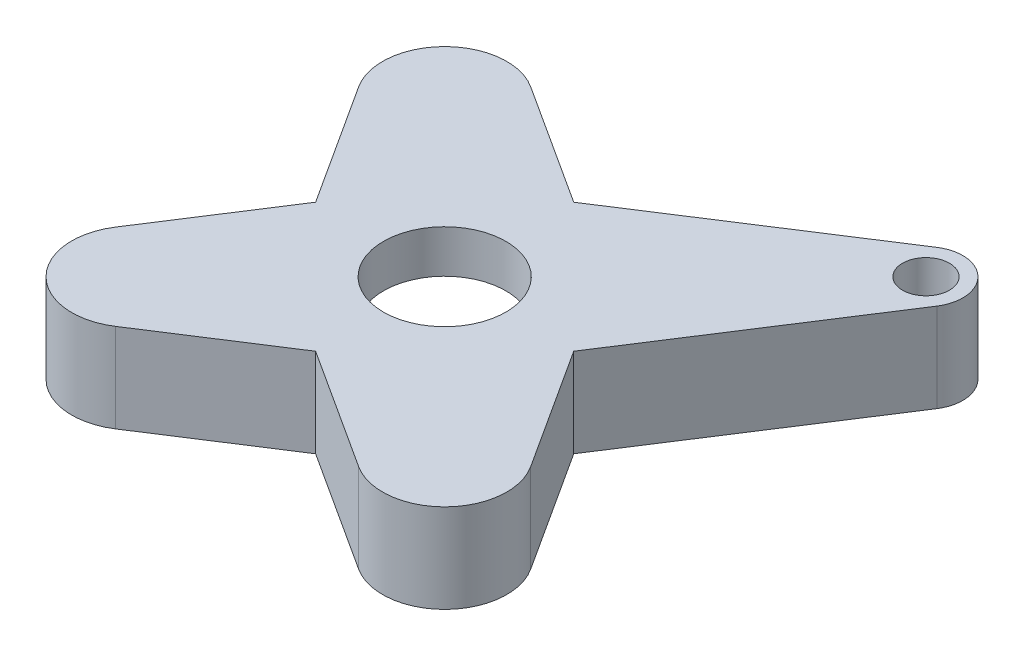
ISO-10303-21;
HEADER;
FILE_DESCRIPTION(('STEP AP214'),'2;1');
FILE_NAME('part.step','',(''),(''),'','','');
FILE_SCHEMA(('AUTOMOTIVE_DESIGN { 1 0 10303 214 1 1 1 1 }'));
ENDSEC;
DATA;
#1=APPLICATION_CONTEXT('core data for automotive mechanical design processes');
#2=APPLICATION_PROTOCOL_DEFINITION('international standard','automotive_design',2000,#1);
#3=PRODUCT_CONTEXT('',#1,'mechanical');
#4=PRODUCT('Part','Part','',(#3));
#5=PRODUCT_RELATED_PRODUCT_CATEGORY('part','',(#4));
#6=PRODUCT_DEFINITION_FORMATION('','',#4);
#7=PRODUCT_DEFINITION_CONTEXT('part definition',#1,'design');
#8=PRODUCT_DEFINITION('design','',#6,#7);
#9=PRODUCT_DEFINITION_SHAPE('','',#8);
#10=(LENGTH_UNIT() NAMED_UNIT(*) SI_UNIT(.MILLI.,.METRE.));
#11=(NAMED_UNIT(*) PLANE_ANGLE_UNIT() SI_UNIT($,.RADIAN.));
#12=(NAMED_UNIT(*) SI_UNIT($,.STERADIAN.) SOLID_ANGLE_UNIT());
#13=UNCERTAINTY_MEASURE_WITH_UNIT(LENGTH_MEASURE(1.E-05),#10,'distance_accuracy_value','');
#14=(GEOMETRIC_REPRESENTATION_CONTEXT(3) GLOBAL_UNCERTAINTY_ASSIGNED_CONTEXT((#13)) GLOBAL_UNIT_ASSIGNED_CONTEXT((#10,
#11,#12)) REPRESENTATION_CONTEXT('',''));
#15=CARTESIAN_POINT('',(0.,0.,0.));
#16=DIRECTION('',(0.,0.,1.));
#17=DIRECTION('',(1.,0.,0.));
#18=AXIS2_PLACEMENT_3D('',#15,#16,#17);
#19=CARTESIAN_POINT('',(17.9605122421383,3.2004,-17.9605122421383));
#20=DIRECTION('',(0.,-1.,0.));
#21=DIRECTION('',(0.,0.,-1.));
#22=AXIS2_PLACEMENT_3D('',#19,#20,#21);
#23=CYLINDRICAL_SURFACE('',#22,2.74563871763991);
#24=DIRECTION('',(0.,-1.,0.));
#25=VECTOR('',#24,1.);
#26=CARTESIAN_POINT('',(20.2671251717621,3.2004,-16.4711940220471));
#27=LINE('',#26,#25);
#28=CARTESIAN_POINT('',(20.2671251717621,3.2004,-16.4711940220471));
#29=VERTEX_POINT('',#28);
#30=CARTESIAN_POINT('',(20.2671251717621,-3.429,-16.4711940220471));
#31=VERTEX_POINT('',#30);
#32=EDGE_CURVE('E247',#29,#31,#27,.T.);
#33=ORIENTED_EDGE('',*,*,#32,.T.);
#34=CARTESIAN_POINT('',(17.9605122421383,-3.429,-17.9605122421383));
#35=DIRECTION('',(0.,1.,0.));
#36=DIRECTION('',(0.,0.,1.));
#37=AXIS2_PLACEMENT_3D('',#34,#35,#36);
#38=CIRCLE('',#37,2.74563871763991);
#39=CARTESIAN_POINT('',(16.4711940220471,-3.429,-20.2671251717621));
#40=VERTEX_POINT('',#39);
#41=EDGE_CURVE('E241',#40,#31,#38,.F.);
#42=ORIENTED_EDGE('',*,*,#41,.F.);
#43=DIRECTION('',(0.,-1.,0.));
#44=VECTOR('',#43,1.);
#45=CARTESIAN_POINT('',(16.4711940220471,3.2004,-20.2671251717621));
#46=LINE('',#45,#44);
#47=CARTESIAN_POINT('',(16.4711940220471,3.2004,-20.2671251717621));
#48=VERTEX_POINT('',#47);
#49=EDGE_CURVE('E11',#48,#40,#46,.T.);
#50=ORIENTED_EDGE('',*,*,#49,.F.);
#51=CARTESIAN_POINT('',(17.9605122421383,3.2004,-17.9605122421383));
#52=DIRECTION('',(0.,1.,0.));
#53=DIRECTION('',(0.,0.,1.));
#54=AXIS2_PLACEMENT_3D('',#51,#52,#53);
#55=CIRCLE('',#54,2.74563871763991);
#56=EDGE_CURVE('E403',#48,#29,#55,.F.);
#57=ORIENTED_EDGE('',*,*,#56,.T.);
#58=EDGE_LOOP('',(#33,#42,#50,#57));
#59=FACE_BOUND('',#58,.T.);
#60=ADVANCED_FACE('F41',(#59),#23,.T.);
#61=CARTESIAN_POINT('',(-4.38931909057284,3.2004,-6.79805029575222));
#62=DIRECTION('',(-0.542430513717173,0.,-0.840100671222517));
#63=DIRECTION('',(-0.840100671222517,0.,0.542430513717173));
#64=AXIS2_PLACEMENT_3D('',#61,#62,#63);
#65=PLANE('',#64);
#66=ORIENTED_EDGE('',*,*,#49,.T.);
#67=DIRECTION('',(0.840100671222517,0.,-0.542430513717173));
#68=VECTOR('',#67,1.);
#69=CARTESIAN_POINT('',(-4.38931909057284,-3.429,-6.79805029575222));
#70=LINE('',#69,#68);
#71=CARTESIAN_POINT('',(0.,-3.429,-9.6321161294378));
#72=VERTEX_POINT('',#71);
#73=EDGE_CURVE('E229',#72,#40,#70,.T.);
#74=ORIENTED_EDGE('',*,*,#73,.F.);
#75=DIRECTION('',(0.,-1.,0.));
#76=VECTOR('',#75,1.);
#77=CARTESIAN_POINT('',(0.,3.2004,-9.6321161294378));
#78=LINE('',#77,#76);
#79=CARTESIAN_POINT('',(0.,3.2004,-9.6321161294378));
#80=VERTEX_POINT('',#79);
#81=EDGE_CURVE('E49',#80,#72,#78,.T.);
#82=ORIENTED_EDGE('',*,*,#81,.F.);
#83=DIRECTION('',(0.840100671222517,0.,-0.542430513717173));
#84=VECTOR('',#83,1.);
#85=CARTESIAN_POINT('',(-4.38931909057284,3.2004,-6.79805029575222));
#86=LINE('',#85,#84);
#87=EDGE_CURVE('E231',#80,#48,#86,.T.);
#88=ORIENTED_EDGE('',*,*,#87,.T.);
#89=EDGE_LOOP('',(#66,#74,#82,#88));
#90=FACE_BOUND('',#89,.T.);
#91=ADVANCED_FACE('F228',(#90),#65,.T.);
#92=CARTESIAN_POINT('',(4.38931909057285,3.2004,-6.79805029575227));
#93=DIRECTION('',(0.542430513717171,0.,-0.840100671222518));
#94=DIRECTION('',(-0.840100671222518,0.,-0.542430513717171));
#95=AXIS2_PLACEMENT_3D('',#92,#93,#94);
#96=PLANE('',#95);
#97=ORIENTED_EDGE('',*,*,#81,.T.);
#98=DIRECTION('',(0.840100671222518,0.,0.542430513717171));
#99=VECTOR('',#98,1.);
#100=CARTESIAN_POINT('',(4.38931909057285,-3.429,-6.79805029575227));
#101=LINE('',#100,#99);
#102=CARTESIAN_POINT('',(-9.0796736278117,-3.429,-15.4946183259319));
#103=VERTEX_POINT('',#102);
#104=EDGE_CURVE('E245',#103,#72,#101,.T.);
#105=ORIENTED_EDGE('',*,*,#104,.F.);
#106=DIRECTION('',(0.,-1.,0.));
#107=VECTOR('',#106,1.);
#108=CARTESIAN_POINT('',(-9.0796736278117,3.2004,-15.4946183259319));
#109=LINE('',#108,#107);
#110=CARTESIAN_POINT('',(-9.0796736278117,3.2004,-15.4946183259319));
#111=VERTEX_POINT('',#110);
#112=EDGE_CURVE('E454',#111,#103,#109,.T.);
#113=ORIENTED_EDGE('',*,*,#112,.F.);
#114=DIRECTION('',(0.840100671222518,0.,0.542430513717171));
#115=VECTOR('',#114,1.);
#116=CARTESIAN_POINT('',(4.38931909057285,3.2004,-6.79805029575227));
#117=LINE('',#116,#115);
#118=EDGE_CURVE('E406',#111,#80,#117,.T.);
#119=ORIENTED_EDGE('',*,*,#118,.T.);
#120=EDGE_LOOP('',(#97,#105,#113,#119));
#121=FACE_BOUND('',#120,.T.);
#122=ADVANCED_FACE('F456',(#121),#96,.T.);
#123=CARTESIAN_POINT('',(-11.5965512114594,3.2004,-11.5965512114594));
#124=DIRECTION('',(0.,-1.,0.));
#125=DIRECTION('',(0.,0.,-1.));
#126=AXIS2_PLACEMENT_3D('',#123,#124,#125);
#127=CYLINDRICAL_SURFACE('',#126,4.64);
#128=ORIENTED_EDGE('',*,*,#112,.T.);
#129=CARTESIAN_POINT('',(-11.5965512114594,-3.429,-11.5965512114594));
#130=DIRECTION('',(0.,1.,0.));
#131=DIRECTION('',(0.,0.,1.));
#132=AXIS2_PLACEMENT_3D('',#129,#130,#131);
#133=CIRCLE('',#132,4.64);
#134=CARTESIAN_POINT('',(-15.4946183259319,-3.429,-9.07967362781171));
#135=VERTEX_POINT('',#134);
#136=EDGE_CURVE('E255',#135,#103,#133,.F.);
#137=ORIENTED_EDGE('',*,*,#136,.F.);
#138=DIRECTION('',(0.,-1.,0.));
#139=VECTOR('',#138,1.);
#140=CARTESIAN_POINT('',(-15.4946183259319,3.2004,-9.07967362781171));
#141=LINE('',#140,#139);
#142=CARTESIAN_POINT('',(-15.4946183259319,3.2004,-9.07967362781171));
#143=VERTEX_POINT('',#142);
#144=EDGE_CURVE('E452',#143,#135,#141,.T.);
#145=ORIENTED_EDGE('',*,*,#144,.F.);
#146=CARTESIAN_POINT('',(-11.5965512114594,3.2004,-11.5965512114594));
#147=DIRECTION('',(0.,1.,0.));
#148=DIRECTION('',(0.,0.,1.));
#149=AXIS2_PLACEMENT_3D('',#146,#147,#148);
#150=CIRCLE('',#149,4.64);
#151=EDGE_CURVE('E409',#143,#111,#150,.F.);
#152=ORIENTED_EDGE('',*,*,#151,.T.);
#153=EDGE_LOOP('',(#128,#137,#145,#152));
#154=FACE_BOUND('',#153,.T.);
#155=ADVANCED_FACE('F463',(#154),#127,.T.);
#156=CARTESIAN_POINT('',(-6.79805029575228,3.2004,4.38931909057286));
#157=DIRECTION('',(-0.840100671222519,0.,0.54243051371717));
#158=DIRECTION('',(0.54243051371717,0.,0.840100671222519));
#159=AXIS2_PLACEMENT_3D('',#156,#157,#158);
#160=PLANE('',#159);
#161=ORIENTED_EDGE('',*,*,#144,.T.);
#162=DIRECTION('',(-0.54243051371717,0.,-0.840100671222519));
#163=VECTOR('',#162,1.);
#164=CARTESIAN_POINT('',(-6.79805029575228,-3.429,4.38931909057286));
#165=LINE('',#164,#163);
#166=CARTESIAN_POINT('',(-9.6321161294378,-3.429,0.));
#167=VERTEX_POINT('',#166);
#168=EDGE_CURVE('E257',#167,#135,#165,.T.);
#169=ORIENTED_EDGE('',*,*,#168,.F.);
#170=DIRECTION('',(0.,-1.,0.));
#171=VECTOR('',#170,1.);
#172=CARTESIAN_POINT('',(-9.6321161294378,3.2004,0.));
#173=LINE('',#172,#171);
#174=CARTESIAN_POINT('',(-9.6321161294378,3.2004,0.));
#175=VERTEX_POINT('',#174);
#176=EDGE_CURVE('E450',#175,#167,#173,.T.);
#177=ORIENTED_EDGE('',*,*,#176,.F.);
#178=DIRECTION('',(-0.54243051371717,0.,-0.840100671222519));
#179=VECTOR('',#178,1.);
#180=CARTESIAN_POINT('',(-6.79805029575228,3.2004,4.38931909057286));
#181=LINE('',#180,#179);
#182=EDGE_CURVE('E412',#175,#143,#181,.T.);
#183=ORIENTED_EDGE('',*,*,#182,.T.);
#184=EDGE_LOOP('',(#161,#169,#177,#183));
#185=FACE_BOUND('',#184,.T.);
#186=ADVANCED_FACE('F467',(#185),#160,.T.);
#187=CARTESIAN_POINT('',(-6.79805029575225,3.2004,-4.38931909057285));
#188=DIRECTION('',(-0.840100671222518,0.,-0.542430513717172));
#189=DIRECTION('',(-0.542430513717172,0.,0.840100671222518));
#190=AXIS2_PLACEMENT_3D('',#187,#188,#189);
#191=PLANE('',#190);
#192=ORIENTED_EDGE('',*,*,#176,.T.);
#193=DIRECTION('',(0.542430513717172,0.,-0.840100671222518));
#194=VECTOR('',#193,1.);
#195=CARTESIAN_POINT('',(-6.79805029575225,-3.429,-4.38931909057285));
#196=LINE('',#195,#194);
#197=CARTESIAN_POINT('',(-15.4946183259319,-3.429,9.0796736278117));
#198=VERTEX_POINT('',#197);
#199=EDGE_CURVE('E260',#198,#167,#196,.T.);
#200=ORIENTED_EDGE('',*,*,#199,.F.);
#201=DIRECTION('',(0.,-1.,0.));
#202=VECTOR('',#201,1.);
#203=CARTESIAN_POINT('',(-15.4946183259319,3.2004,9.0796736278117));
#204=LINE('',#203,#202);
#205=CARTESIAN_POINT('',(-15.4946183259319,3.2004,9.0796736278117));
#206=VERTEX_POINT('',#205);
#207=EDGE_CURVE('E448',#206,#198,#204,.T.);
#208=ORIENTED_EDGE('',*,*,#207,.F.);
#209=DIRECTION('',(0.542430513717172,0.,-0.840100671222518));
#210=VECTOR('',#209,1.);
#211=CARTESIAN_POINT('',(-6.79805029575225,3.2004,-4.38931909057285));
#212=LINE('',#211,#210);
#213=EDGE_CURVE('E415',#206,#175,#212,.T.);
#214=ORIENTED_EDGE('',*,*,#213,.T.);
#215=EDGE_LOOP('',(#192,#200,#208,#214));
#216=FACE_BOUND('',#215,.T.);
#217=ADVANCED_FACE('F472',(#216),#191,.T.);
#218=CARTESIAN_POINT('',(-11.5965512114594,3.2004,11.5965512114594));
#219=DIRECTION('',(0.,-1.,0.));
#220=DIRECTION('',(0.,0.,-1.));
#221=AXIS2_PLACEMENT_3D('',#218,#219,#220);
#222=CYLINDRICAL_SURFACE('',#221,4.64);
#223=ORIENTED_EDGE('',*,*,#207,.T.);
#224=CARTESIAN_POINT('',(-11.5965512114594,-3.429,11.5965512114594));
#225=DIRECTION('',(0.,1.,0.));
#226=DIRECTION('',(0.,0.,1.));
#227=AXIS2_PLACEMENT_3D('',#224,#225,#226);
#228=CIRCLE('',#227,4.64);
#229=CARTESIAN_POINT('',(-9.07967362781171,-3.429,15.4946183259319));
#230=VERTEX_POINT('',#229);
#231=EDGE_CURVE('E263',#198,#230,#228,.T.);
#232=ORIENTED_EDGE('',*,*,#231,.T.);
#233=DIRECTION('',(0.,-1.,0.));
#234=VECTOR('',#233,1.);
#235=CARTESIAN_POINT('',(-9.07967362781171,3.2004,15.4946183259319));
#236=LINE('',#235,#234);
#237=CARTESIAN_POINT('',(-9.07967362781171,3.2004,15.4946183259319));
#238=VERTEX_POINT('',#237);
#239=EDGE_CURVE('E446',#238,#230,#236,.T.);
#240=ORIENTED_EDGE('',*,*,#239,.F.);
#241=CARTESIAN_POINT('',(-11.5965512114594,3.2004,11.5965512114594));
#242=DIRECTION('',(0.,1.,0.));
#243=DIRECTION('',(0.,0.,1.));
#244=AXIS2_PLACEMENT_3D('',#241,#242,#243);
#245=CIRCLE('',#244,4.64);
#246=EDGE_CURVE('E418',#206,#238,#245,.T.);
#247=ORIENTED_EDGE('',*,*,#246,.F.);
#248=EDGE_LOOP('',(#223,#232,#240,#247));
#249=FACE_BOUND('',#248,.T.);
#250=ADVANCED_FACE('F479',(#249),#222,.T.);
#251=CARTESIAN_POINT('',(4.38931909057286,3.2004,6.79805029575229));
#252=DIRECTION('',(-0.54243051371717,0.,-0.840100671222519));
#253=DIRECTION('',(-0.840100671222519,0.,0.54243051371717));
#254=AXIS2_PLACEMENT_3D('',#251,#252,#253);
#255=PLANE('',#254);
#256=ORIENTED_EDGE('',*,*,#239,.T.);
#257=DIRECTION('',(0.840100671222519,0.,-0.54243051371717));
#258=VECTOR('',#257,1.);
#259=CARTESIAN_POINT('',(4.38931909057286,-3.429,6.79805029575229));
#260=LINE('',#259,#258);
#261=CARTESIAN_POINT('',(0.,-3.429,9.6321161294378));
#262=VERTEX_POINT('',#261);
#263=EDGE_CURVE('E266',#230,#262,#260,.T.);
#264=ORIENTED_EDGE('',*,*,#263,.T.);
#265=DIRECTION('',(0.,-1.,0.));
#266=VECTOR('',#265,1.);
#267=CARTESIAN_POINT('',(0.,3.2004,9.6321161294378));
#268=LINE('',#267,#266);
#269=CARTESIAN_POINT('',(0.,3.2004,9.6321161294378));
#270=VERTEX_POINT('',#269);
#271=EDGE_CURVE('E444',#270,#262,#268,.T.);
#272=ORIENTED_EDGE('',*,*,#271,.F.);
#273=DIRECTION('',(0.840100671222519,0.,-0.54243051371717));
#274=VECTOR('',#273,1.);
#275=CARTESIAN_POINT('',(4.38931909057286,3.2004,6.79805029575229));
#276=LINE('',#275,#274);
#277=EDGE_CURVE('E421',#238,#270,#276,.T.);
#278=ORIENTED_EDGE('',*,*,#277,.F.);
#279=EDGE_LOOP('',(#256,#264,#272,#278));
#280=FACE_BOUND('',#279,.T.);
#281=ADVANCED_FACE('F481',(#280),#255,.F.);
#282=CARTESIAN_POINT('',(-4.38931909057285,3.2004,6.79805029575226));
#283=DIRECTION('',(-0.542430513717171,0.,0.840100671222518));
#284=DIRECTION('',(0.840100671222518,0.,0.542430513717171));
#285=AXIS2_PLACEMENT_3D('',#282,#283,#284);
#286=PLANE('',#285);
#287=ORIENTED_EDGE('',*,*,#271,.T.);
#288=DIRECTION('',(-0.840100671222518,0.,-0.542430513717171));
#289=VECTOR('',#288,1.);
#290=CARTESIAN_POINT('',(-4.38931909057285,-3.429,6.79805029575226));
#291=LINE('',#290,#289);
#292=CARTESIAN_POINT('',(9.07967362781171,-3.429,15.4946183259319));
#293=VERTEX_POINT('',#292);
#294=EDGE_CURVE('E269',#293,#262,#291,.T.);
#295=ORIENTED_EDGE('',*,*,#294,.F.);
#296=DIRECTION('',(0.,-1.,0.));
#297=VECTOR('',#296,1.);
#298=CARTESIAN_POINT('',(9.07967362781171,3.2004,15.4946183259319));
#299=LINE('',#298,#297);
#300=CARTESIAN_POINT('',(9.07967362781171,3.2004,15.4946183259319));
#301=VERTEX_POINT('',#300);
#302=EDGE_CURVE('E442',#301,#293,#299,.T.);
#303=ORIENTED_EDGE('',*,*,#302,.F.);
#304=DIRECTION('',(-0.840100671222518,0.,-0.542430513717171));
#305=VECTOR('',#304,1.);
#306=CARTESIAN_POINT('',(-4.38931909057285,3.2004,6.79805029575226));
#307=LINE('',#306,#305);
#308=EDGE_CURVE('E423',#301,#270,#307,.T.);
#309=ORIENTED_EDGE('',*,*,#308,.T.);
#310=EDGE_LOOP('',(#287,#295,#303,#309));
#311=FACE_BOUND('',#310,.T.);
#312=ADVANCED_FACE('F486',(#311),#286,.T.);
#313=CARTESIAN_POINT('',(11.5965512114594,3.2004,11.5965512114594));
#314=DIRECTION('',(0.,-1.,0.));
#315=DIRECTION('',(0.,0.,-1.));
#316=AXIS2_PLACEMENT_3D('',#313,#314,#315);
#317=CYLINDRICAL_SURFACE('',#316,4.63999999999999);
#318=ORIENTED_EDGE('',*,*,#302,.T.);
#319=CARTESIAN_POINT('',(11.5965512114594,-3.429,11.5965512114594));
#320=DIRECTION('',(0.,1.,0.));
#321=DIRECTION('',(0.,0.,1.));
#322=AXIS2_PLACEMENT_3D('',#319,#320,#321);
#323=CIRCLE('',#322,4.63999999999999);
#324=CARTESIAN_POINT('',(15.4946183259319,-3.429,9.07967362781171));
#325=VERTEX_POINT('',#324);
#326=EDGE_CURVE('E272',#325,#293,#323,.F.);
#327=ORIENTED_EDGE('',*,*,#326,.F.);
#328=DIRECTION('',(0.,-1.,0.));
#329=VECTOR('',#328,1.);
#330=CARTESIAN_POINT('',(15.4946183259319,3.2004,9.07967362781171));
#331=LINE('',#330,#329);
#332=CARTESIAN_POINT('',(15.4946183259319,3.2004,9.07967362781171));
#333=VERTEX_POINT('',#332);
#334=EDGE_CURVE('E440',#333,#325,#331,.T.);
#335=ORIENTED_EDGE('',*,*,#334,.F.);
#336=CARTESIAN_POINT('',(11.5965512114594,3.2004,11.5965512114594));
#337=DIRECTION('',(0.,1.,0.));
#338=DIRECTION('',(0.,0.,1.));
#339=AXIS2_PLACEMENT_3D('',#336,#337,#338);
#340=CIRCLE('',#339,4.63999999999999);
#341=EDGE_CURVE('E426',#333,#301,#340,.F.);
#342=ORIENTED_EDGE('',*,*,#341,.T.);
#343=EDGE_LOOP('',(#318,#327,#335,#342));
#344=FACE_BOUND('',#343,.T.);
#345=ADVANCED_FACE('F489',(#344),#317,.T.);
#346=CARTESIAN_POINT('',(6.79805029575228,3.2004,-4.38931909057285));
#347=DIRECTION('',(-0.840100671222519,0.,0.54243051371717));
#348=DIRECTION('',(0.54243051371717,0.,0.840100671222519));
#349=AXIS2_PLACEMENT_3D('',#346,#347,#348);
#350=PLANE('',#349);
#351=ORIENTED_EDGE('',*,*,#334,.T.);
#352=DIRECTION('',(-0.54243051371717,0.,-0.840100671222519));
#353=VECTOR('',#352,1.);
#354=CARTESIAN_POINT('',(6.79805029575228,-3.429,-4.38931909057285));
#355=LINE('',#354,#353);
#356=CARTESIAN_POINT('',(9.6321161294378,-3.429,0.));
#357=VERTEX_POINT('',#356);
#358=EDGE_CURVE('E275',#325,#357,#355,.T.);
#359=ORIENTED_EDGE('',*,*,#358,.T.);
#360=DIRECTION('',(0.,-1.,0.));
#361=VECTOR('',#360,1.);
#362=CARTESIAN_POINT('',(9.6321161294378,3.2004,0.));
#363=LINE('',#362,#361);
#364=CARTESIAN_POINT('',(9.6321161294378,3.2004,0.));
#365=VERTEX_POINT('',#364);
#366=EDGE_CURVE('E438',#365,#357,#363,.T.);
#367=ORIENTED_EDGE('',*,*,#366,.F.);
#368=DIRECTION('',(-0.54243051371717,0.,-0.840100671222519));
#369=VECTOR('',#368,1.);
#370=CARTESIAN_POINT('',(6.79805029575228,3.2004,-4.38931909057285));
#371=LINE('',#370,#369);
#372=EDGE_CURVE('E429',#333,#365,#371,.T.);
#373=ORIENTED_EDGE('',*,*,#372,.F.);
#374=EDGE_LOOP('',(#351,#359,#367,#373));
#375=FACE_BOUND('',#374,.T.);
#376=ADVANCED_FACE('F493',(#375),#350,.F.);
#377=CARTESIAN_POINT('',(6.79805029575227,3.2004,4.38931909057286));
#378=DIRECTION('',(-0.840100671222518,0.,-0.542430513717171));
#379=DIRECTION('',(-0.542430513717171,0.,0.840100671222519));
#380=AXIS2_PLACEMENT_3D('',#377,#378,#379);
#381=PLANE('',#380);
#382=ORIENTED_EDGE('',*,*,#366,.T.);
#383=DIRECTION('',(0.542430513717171,0.,-0.840100671222518));
#384=VECTOR('',#383,1.);
#385=CARTESIAN_POINT('',(6.79805029575227,-3.429,4.38931909057286));
#386=LINE('',#385,#384);
#387=EDGE_CURVE('E278',#357,#31,#386,.T.);
#388=ORIENTED_EDGE('',*,*,#387,.T.);
#389=ORIENTED_EDGE('',*,*,#32,.F.);
#390=DIRECTION('',(0.542430513717171,0.,-0.840100671222518));
#391=VECTOR('',#390,1.);
#392=CARTESIAN_POINT('',(6.79805029575227,3.2004,4.38931909057286));
#393=LINE('',#392,#391);
#394=EDGE_CURVE('E64',#365,#29,#393,.T.);
#395=ORIENTED_EDGE('',*,*,#394,.F.);
#396=EDGE_LOOP('',(#382,#388,#389,#395));
#397=FACE_BOUND('',#396,.T.);
#398=ADVANCED_FACE('F495',(#397),#381,.F.);
#399=CARTESIAN_POINT('',(17.9605122421383,3.2004,-17.9605122421383));
#400=DIRECTION('',(0.,-1.,0.));
#401=DIRECTION('',(0.,0.,-1.));
#402=AXIS2_PLACEMENT_3D('',#399,#400,#401);
#403=CYLINDRICAL_SURFACE('',#402,1.75);
#404=CARTESIAN_POINT('',(17.9605122421383,3.2004,-17.9605122421383));
#405=DIRECTION('',(0.,1.,0.));
#406=DIRECTION('',(0.,0.,1.));
#407=AXIS2_PLACEMENT_3D('',#404,#405,#406);
#408=CIRCLE('',#407,1.75);
#409=CARTESIAN_POINT('',(17.9605122421383,3.2004,-16.2105122421383));
#410=VERTEX_POINT('',#409);
#411=EDGE_CURVE('E400',#410,#410,#408,.T.);
#412=ORIENTED_EDGE('',*,*,#411,.T.);
#413=EDGE_LOOP('',(#412));
#414=FACE_BOUND('',#413,.T.);
#415=CARTESIAN_POINT('',(17.9605122421383,-3.429,-17.9605122421383));
#416=DIRECTION('',(0.,1.,0.));
#417=DIRECTION('',(0.,0.,1.));
#418=AXIS2_PLACEMENT_3D('',#415,#416,#417);
#419=CIRCLE('',#418,1.75);
#420=CARTESIAN_POINT('',(17.9605122421383,-3.429,-16.2105122421383));
#421=VERTEX_POINT('',#420);
#422=EDGE_CURVE('E248',#421,#421,#419,.T.);
#423=ORIENTED_EDGE('',*,*,#422,.F.);
#424=EDGE_LOOP('',(#423));
#425=FACE_BOUND('',#424,.T.);
#426=ADVANCED_FACE('F43',(#414,#425),#403,.F.);
#427=CARTESIAN_POINT('',(0.,3.2004,0.));
#428=DIRECTION('',(0.,-1.,0.));
#429=DIRECTION('',(0.,0.,-1.));
#430=AXIS2_PLACEMENT_3D('',#427,#428,#429);
#431=CYLINDRICAL_SURFACE('',#430,4.572);
#432=CARTESIAN_POINT('',(0.,3.2004,0.));
#433=DIRECTION('',(0.,1.,0.));
#434=DIRECTION('',(0.,0.,1.));
#435=AXIS2_PLACEMENT_3D('',#432,#433,#434);
#436=CIRCLE('',#435,4.572);
#437=CARTESIAN_POINT('',(0.,3.2004,4.572));
#438=VERTEX_POINT('',#437);
#439=EDGE_CURVE('E432',#438,#438,#436,.T.);
#440=ORIENTED_EDGE('',*,*,#439,.T.);
#441=EDGE_LOOP('',(#440));
#442=FACE_BOUND('',#441,.T.);
#443=CARTESIAN_POINT('',(0.,0.,0.));
#444=DIRECTION('',(0.,1.,0.));
#445=DIRECTION('',(0.,0.,1.));
#446=AXIS2_PLACEMENT_3D('',#443,#444,#445);
#447=CIRCLE('',#446,4.572);
#448=CARTESIAN_POINT('',(0.,0.,4.572));
#449=VERTEX_POINT('',#448);
#450=EDGE_CURVE('E368',#449,#449,#447,.T.);
#451=ORIENTED_EDGE('',*,*,#450,.F.);
#452=EDGE_LOOP('',(#451));
#453=FACE_BOUND('',#452,.T.);
#454=ADVANCED_FACE('F502',(#442,#453),#431,.F.);
#455=CARTESIAN_POINT('',(0.,3.2004,0.));
#456=DIRECTION('',(0.,1.,0.));
#457=DIRECTION('',(0.,0.,1.));
#458=AXIS2_PLACEMENT_3D('',#455,#456,#457);
#459=PLANE('',#458);
#460=ORIENTED_EDGE('',*,*,#411,.F.);
#461=EDGE_LOOP('',(#460));
#462=FACE_BOUND('',#461,.T.);
#463=ORIENTED_EDGE('',*,*,#56,.F.);
#464=ORIENTED_EDGE('',*,*,#87,.F.);
#465=ORIENTED_EDGE('',*,*,#118,.F.);
#466=ORIENTED_EDGE('',*,*,#151,.F.);
#467=ORIENTED_EDGE('',*,*,#182,.F.);
#468=ORIENTED_EDGE('',*,*,#213,.F.);
#469=ORIENTED_EDGE('',*,*,#246,.T.);
#470=ORIENTED_EDGE('',*,*,#277,.T.);
#471=ORIENTED_EDGE('',*,*,#308,.F.);
#472=ORIENTED_EDGE('',*,*,#341,.F.);
#473=ORIENTED_EDGE('',*,*,#372,.T.);
#474=ORIENTED_EDGE('',*,*,#394,.T.);
#475=EDGE_LOOP('',(#463,#464,#465,#466,#467,#468,#469,#470,#471,#472,#473,#474));
#476=FACE_BOUND('',#475,.T.);
#477=ORIENTED_EDGE('',*,*,#439,.F.);
#478=EDGE_LOOP('',(#477));
#479=FACE_BOUND('',#478,.T.);
#480=ADVANCED_FACE('F458',(#462,#476,#479),#459,.T.);
#481=CARTESIAN_POINT('',(0.,0.,0.));
#482=DIRECTION('',(0.,1.,0.));
#483=DIRECTION('',(0.,0.,1.));
#484=AXIS2_PLACEMENT_3D('',#481,#482,#483);
#485=PLANE('',#484);
#486=DIRECTION('',(0.54243051371717,0.,-0.840100671222519));
#487=VECTOR('',#486,1.);
#488=CARTESIAN_POINT('',(5.19765851707338,0.,3.35598896194164));
#489=LINE('',#488,#487);
#490=CARTESIAN_POINT('',(8.02381642200241,0.,-1.02108255758146));
#491=VERTEX_POINT('',#490);
#492=CARTESIAN_POINT('',(13.894226547253,0.,-10.1130037564429));
#493=VERTEX_POINT('',#492);
#494=EDGE_CURVE('E56',#491,#493,#489,.T.);
#495=ORIENTED_EDGE('',*,*,#494,.F.);
#496=CARTESIAN_POINT('',(8.56364547883699,0.,0.));
#497=DIRECTION('',(0.,1.,0.));
#498=DIRECTION('',(0.,0.,1.));
#499=AXIS2_PLACEMENT_3D('',#496,#497,#498);
#500=CIRCLE('',#499,1.15499999999999);
#501=CARTESIAN_POINT('',(8.02381642200239,0.,1.02108255758144));
#502=VERTEX_POINT('',#501);
#503=EDGE_CURVE('E324',#491,#502,#500,.T.);
#504=ORIENTED_EDGE('',*,*,#503,.T.);
#505=DIRECTION('',(-0.542430513717171,0.,-0.840100671222518));
#506=VECTOR('',#505,1.);
#507=CARTESIAN_POINT('',(5.19765851707337,0.,-3.35598896194164));
#508=LINE('',#507,#506);
#509=CARTESIAN_POINT('',(13.894226547253,0.,10.1130037564429));
#510=VERTEX_POINT('',#509);
#511=EDGE_CURVE('E327',#510,#502,#508,.T.);
#512=ORIENTED_EDGE('',*,*,#511,.F.);
#513=CARTESIAN_POINT('',(11.5965512114594,0.,11.5965512114594));
#514=DIRECTION('',(0.,1.,0.));
#515=DIRECTION('',(0.,0.,1.));
#516=AXIS2_PLACEMENT_3D('',#513,#514,#515);
#517=CIRCLE('',#516,2.735);
#518=CARTESIAN_POINT('',(10.1130037564429,0.,13.894226547253));
#519=VERTEX_POINT('',#518);
#520=EDGE_CURVE('E330',#510,#519,#517,.F.);
#521=ORIENTED_EDGE('',*,*,#520,.T.);
#522=DIRECTION('',(-0.840100671222518,0.,-0.542430513717171));
#523=VECTOR('',#522,1.);
#524=CARTESIAN_POINT('',(-3.35598896194164,0.,5.19765851707336));
#525=LINE('',#524,#523);
#526=CARTESIAN_POINT('',(1.02108255758145,0.,8.02381642200239));
#527=VERTEX_POINT('',#526);
#528=EDGE_CURVE('E333',#519,#527,#525,.T.);
#529=ORIENTED_EDGE('',*,*,#528,.T.);
#530=CARTESIAN_POINT('',(0.,0.,8.56364547883699));
#531=DIRECTION('',(0.,1.,0.));
#532=DIRECTION('',(0.,0.,1.));
#533=AXIS2_PLACEMENT_3D('',#530,#531,#532);
#534=CIRCLE('',#533,1.155);
#535=CARTESIAN_POINT('',(-1.02108255758145,0.,8.0238164220024));
#536=VERTEX_POINT('',#535);
#537=EDGE_CURVE('E336',#536,#527,#534,.F.);
#538=ORIENTED_EDGE('',*,*,#537,.F.);
#539=DIRECTION('',(0.840100671222518,0.,-0.542430513717172));
#540=VECTOR('',#539,1.);
#541=CARTESIAN_POINT('',(3.35598896194164,0.,5.19765851707336));
#542=LINE('',#541,#540);
#543=CARTESIAN_POINT('',(-10.1130037564429,0.,13.894226547253));
#544=VERTEX_POINT('',#543);
#545=EDGE_CURVE('E339',#544,#536,#542,.T.);
#546=ORIENTED_EDGE('',*,*,#545,.F.);
#547=CARTESIAN_POINT('',(-11.5965512114594,0.,11.5965512114594));
#548=DIRECTION('',(0.,1.,0.));
#549=DIRECTION('',(0.,0.,1.));
#550=AXIS2_PLACEMENT_3D('',#547,#548,#549);
#551=CIRCLE('',#550,2.735);
#552=CARTESIAN_POINT('',(-13.894226547253,0.,10.1130037564429));
#553=VERTEX_POINT('',#552);
#554=EDGE_CURVE('E341',#553,#544,#551,.T.);
#555=ORIENTED_EDGE('',*,*,#554,.F.);
#556=DIRECTION('',(0.542430513717172,0.,-0.840100671222518));
#557=VECTOR('',#556,1.);
#558=CARTESIAN_POINT('',(-5.19765851707336,0.,-3.35598896194164));
#559=LINE('',#558,#557);
#560=CARTESIAN_POINT('',(-8.02381642200239,0.,1.02108255758145));
#561=VERTEX_POINT('',#560);
#562=EDGE_CURVE('E343',#553,#561,#559,.T.);
#563=ORIENTED_EDGE('',*,*,#562,.T.);
#564=CARTESIAN_POINT('',(-8.56364547883699,0.,0.));
#565=DIRECTION('',(0.,1.,0.));
#566=DIRECTION('',(0.,0.,1.));
#567=AXIS2_PLACEMENT_3D('',#564,#565,#566);
#568=CIRCLE('',#567,1.155);
#569=CARTESIAN_POINT('',(-8.0238164220024,0.,-1.02108255758145));
#570=VERTEX_POINT('',#569);
#571=EDGE_CURVE('E346',#570,#561,#568,.F.);
#572=ORIENTED_EDGE('',*,*,#571,.F.);
#573=DIRECTION('',(-0.542430513717172,0.,-0.840100671222518));
#574=VECTOR('',#573,1.);
#575=CARTESIAN_POINT('',(-5.19765851707335,0.,3.35598896194164));
#576=LINE('',#575,#574);
#577=CARTESIAN_POINT('',(-13.894226547253,0.,-10.1130037564429));
#578=VERTEX_POINT('',#577);
#579=EDGE_CURVE('E349',#570,#578,#576,.T.);
#580=ORIENTED_EDGE('',*,*,#579,.T.);
#581=CARTESIAN_POINT('',(-11.5965512114594,0.,-11.5965512114594));
#582=DIRECTION('',(0.,1.,0.));
#583=DIRECTION('',(0.,0.,1.));
#584=AXIS2_PLACEMENT_3D('',#581,#582,#583);
#585=CIRCLE('',#584,2.735);
#586=CARTESIAN_POINT('',(-10.1130037564429,0.,-13.894226547253));
#587=VERTEX_POINT('',#586);
#588=EDGE_CURVE('E352',#578,#587,#585,.F.);
#589=ORIENTED_EDGE('',*,*,#588,.T.);
#590=DIRECTION('',(0.840100671222518,0.,0.542430513717171));
#591=VECTOR('',#590,1.);
#592=CARTESIAN_POINT('',(3.35598896194164,0.,-5.19765851707337));
#593=LINE('',#592,#591);
#594=CARTESIAN_POINT('',(-1.02108255758144,0.,-8.0238164220024));
#595=VERTEX_POINT('',#594);
#596=EDGE_CURVE('E355',#587,#595,#593,.T.);
#597=ORIENTED_EDGE('',*,*,#596,.T.);
#598=CARTESIAN_POINT('',(0.,0.,-8.563645478837));
#599=DIRECTION('',(0.,1.,0.));
#600=DIRECTION('',(0.,0.,1.));
#601=AXIS2_PLACEMENT_3D('',#598,#599,#600);
#602=CIRCLE('',#601,1.155);
#603=CARTESIAN_POINT('',(1.02108255758145,0.,-8.02381642200241));
#604=VERTEX_POINT('',#603);
#605=EDGE_CURVE('E358',#595,#604,#602,.T.);
#606=ORIENTED_EDGE('',*,*,#605,.T.);
#607=DIRECTION('',(0.840100671222519,0.,-0.542430513717171));
#608=VECTOR('',#607,1.);
#609=CARTESIAN_POINT('',(-3.35598896194164,0.,-5.19765851707337));
#610=LINE('',#609,#608);
#611=CARTESIAN_POINT('',(10.1130037564429,0.,-13.894226547253));
#612=VERTEX_POINT('',#611);
#613=EDGE_CURVE('E361',#604,#612,#610,.T.);
#614=ORIENTED_EDGE('',*,*,#613,.T.);
#615=CARTESIAN_POINT('',(11.5965512114594,0.,-11.5965512114594));
#616=DIRECTION('',(0.,1.,0.));
#617=DIRECTION('',(0.,0.,1.));
#618=AXIS2_PLACEMENT_3D('',#615,#616,#617);
#619=CIRCLE('',#618,2.73499999999999);
#620=EDGE_CURVE('E251',#612,#493,#619,.F.);
#621=ORIENTED_EDGE('',*,*,#620,.T.);
#622=EDGE_LOOP('',(#495,#504,#512,#521,#529,#538,#546,#555,#563,#572,#580,#589,#597,#606,#614,#621));
#623=FACE_BOUND('',#622,.T.);
#624=ORIENTED_EDGE('',*,*,#450,.T.);
#625=EDGE_LOOP('',(#624));
#626=FACE_BOUND('',#625,.T.);
#627=ADVANCED_FACE('F570',(#623,#626),#485,.F.);
#628=CARTESIAN_POINT('',(5.19765851707338,-3.429,3.35598896194164));
#629=DIRECTION('',(0.840100671222519,0.,0.54243051371717));
#630=DIRECTION('',(0.54243051371717,0.,-0.840100671222519));
#631=AXIS2_PLACEMENT_3D('',#628,#629,#630);
#632=PLANE('',#631);
#633=ORIENTED_EDGE('',*,*,#494,.T.);
#634=DIRECTION('',(0.,1.,0.));
#635=VECTOR('',#634,1.);
#636=CARTESIAN_POINT('',(13.894226547253,-3.429,-10.1130037564429));
#637=LINE('',#636,#635);
#638=CARTESIAN_POINT('',(13.894226547253,-3.429,-10.1130037564429));
#639=VERTEX_POINT('',#638);
#640=EDGE_CURVE('E366',#639,#493,#637,.T.);
#641=ORIENTED_EDGE('',*,*,#640,.F.);
#642=DIRECTION('',(0.54243051371717,0.,-0.840100671222519));
#643=VECTOR('',#642,1.);
#644=CARTESIAN_POINT('',(5.19765851707338,-3.429,3.35598896194164));
#645=LINE('',#644,#643);
#646=CARTESIAN_POINT('',(8.02381642200241,-3.429,-1.02108255758146));
#647=VERTEX_POINT('',#646);
#648=EDGE_CURVE('E280',#647,#639,#645,.T.);
#649=ORIENTED_EDGE('',*,*,#648,.F.);
#650=DIRECTION('',(0.,1.,0.));
#651=VECTOR('',#650,1.);
#652=CARTESIAN_POINT('',(8.02381642200241,-3.429,-1.02108255758146));
#653=LINE('',#652,#651);
#654=EDGE_CURVE('E322',#647,#491,#653,.T.);
#655=ORIENTED_EDGE('',*,*,#654,.T.);
#656=EDGE_LOOP('',(#633,#641,#649,#655));
#657=FACE_BOUND('',#656,.T.);
#658=ADVANCED_FACE('F563',(#657),#632,.F.);
#659=CARTESIAN_POINT('',(11.5965512114594,-3.429,-11.5965512114594));
#660=DIRECTION('',(0.,1.,0.));
#661=DIRECTION('',(0.,0.,1.));
#662=AXIS2_PLACEMENT_3D('',#659,#660,#661);
#663=CYLINDRICAL_SURFACE('',#662,2.73499999999999);
#664=ORIENTED_EDGE('',*,*,#620,.F.);
#665=DIRECTION('',(0.,1.,0.));
#666=VECTOR('',#665,1.);
#667=CARTESIAN_POINT('',(10.1130037564429,-3.429,-13.894226547253));
#668=LINE('',#667,#666);
#669=CARTESIAN_POINT('',(10.1130037564429,-3.429,-13.894226547253));
#670=VERTEX_POINT('',#669);
#671=EDGE_CURVE('E369',#670,#612,#668,.T.);
#672=ORIENTED_EDGE('',*,*,#671,.F.);
#673=CARTESIAN_POINT('',(11.5965512114594,-3.429,-11.5965512114594));
#674=DIRECTION('',(0.,1.,0.));
#675=DIRECTION('',(0.,0.,1.));
#676=AXIS2_PLACEMENT_3D('',#673,#674,#675);
#677=CIRCLE('',#676,2.73499999999999);
#678=EDGE_CURVE('E319',#670,#639,#677,.F.);
#679=ORIENTED_EDGE('',*,*,#678,.T.);
#680=ORIENTED_EDGE('',*,*,#640,.T.);
#681=EDGE_LOOP('',(#664,#672,#679,#680));
#682=FACE_BOUND('',#681,.T.);
#683=ADVANCED_FACE('F569',(#682),#663,.F.);
#684=CARTESIAN_POINT('',(-3.35598896194164,-3.429,-5.19765851707337));
#685=DIRECTION('',(0.542430513717171,0.,0.840100671222519));
#686=DIRECTION('',(0.840100671222519,0.,-0.542430513717171));
#687=AXIS2_PLACEMENT_3D('',#684,#685,#686);
#688=PLANE('',#687);
#689=ORIENTED_EDGE('',*,*,#613,.F.);
#690=DIRECTION('',(0.,1.,0.));
#691=VECTOR('',#690,1.);
#692=CARTESIAN_POINT('',(1.02108255758145,-3.429,-8.02381642200241));
#693=LINE('',#692,#691);
#694=CARTESIAN_POINT('',(1.02108255758145,-3.429,-8.02381642200241));
#695=VERTEX_POINT('',#694);
#696=EDGE_CURVE('E371',#695,#604,#693,.T.);
#697=ORIENTED_EDGE('',*,*,#696,.F.);
#698=DIRECTION('',(0.840100671222519,0.,-0.542430513717171));
#699=VECTOR('',#698,1.);
#700=CARTESIAN_POINT('',(-3.35598896194164,-3.429,-5.19765851707337));
#701=LINE('',#700,#699);
#702=EDGE_CURVE('E316',#695,#670,#701,.T.);
#703=ORIENTED_EDGE('',*,*,#702,.T.);
#704=ORIENTED_EDGE('',*,*,#671,.T.);
#705=EDGE_LOOP('',(#689,#697,#703,#704));
#706=FACE_BOUND('',#705,.T.);
#707=ADVANCED_FACE('F580',(#706),#688,.T.);
#708=CARTESIAN_POINT('',(0.,-3.429,-8.563645478837));
#709=DIRECTION('',(0.,1.,0.));
#710=DIRECTION('',(0.,0.,1.));
#711=AXIS2_PLACEMENT_3D('',#708,#709,#710);
#712=CYLINDRICAL_SURFACE('',#711,1.155);
#713=ORIENTED_EDGE('',*,*,#605,.F.);
#714=DIRECTION('',(0.,1.,0.));
#715=VECTOR('',#714,1.);
#716=CARTESIAN_POINT('',(-1.02108255758144,-3.429,-8.0238164220024));
#717=LINE('',#716,#715);
#718=CARTESIAN_POINT('',(-1.02108255758144,-3.429,-8.0238164220024));
#719=VERTEX_POINT('',#718);
#720=EDGE_CURVE('E373',#719,#595,#717,.T.);
#721=ORIENTED_EDGE('',*,*,#720,.F.);
#722=CARTESIAN_POINT('',(0.,-3.429,-8.563645478837));
#723=DIRECTION('',(0.,1.,0.));
#724=DIRECTION('',(0.,0.,1.));
#725=AXIS2_PLACEMENT_3D('',#722,#723,#724);
#726=CIRCLE('',#725,1.155);
#727=EDGE_CURVE('E313',#719,#695,#726,.T.);
#728=ORIENTED_EDGE('',*,*,#727,.T.);
#729=ORIENTED_EDGE('',*,*,#696,.T.);
#730=EDGE_LOOP('',(#713,#721,#728,#729));
#731=FACE_BOUND('',#730,.T.);
#732=ADVANCED_FACE('F590',(#731),#712,.T.);
#733=CARTESIAN_POINT('',(3.35598896194164,-3.429,-5.19765851707337));
#734=DIRECTION('',(-0.542430513717171,0.,0.840100671222519));
#735=DIRECTION('',(0.840100671222519,0.,0.542430513717171));
#736=AXIS2_PLACEMENT_3D('',#733,#734,#735);
#737=PLANE('',#736);
#738=ORIENTED_EDGE('',*,*,#596,.F.);
#739=DIRECTION('',(0.,1.,0.));
#740=VECTOR('',#739,1.);
#741=CARTESIAN_POINT('',(-10.1130037564429,-3.429,-13.894226547253));
#742=LINE('',#741,#740);
#743=CARTESIAN_POINT('',(-10.1130037564429,-3.429,-13.894226547253));
#744=VERTEX_POINT('',#743);
#745=EDGE_CURVE('E375',#744,#587,#742,.T.);
#746=ORIENTED_EDGE('',*,*,#745,.F.);
#747=DIRECTION('',(0.840100671222518,0.,0.542430513717171));
#748=VECTOR('',#747,1.);
#749=CARTESIAN_POINT('',(3.35598896194164,-3.429,-5.19765851707337));
#750=LINE('',#749,#748);
#751=EDGE_CURVE('E310',#744,#719,#750,.T.);
#752=ORIENTED_EDGE('',*,*,#751,.T.);
#753=ORIENTED_EDGE('',*,*,#720,.T.);
#754=EDGE_LOOP('',(#738,#746,#752,#753));
#755=FACE_BOUND('',#754,.T.);
#756=ADVANCED_FACE('F600',(#755),#737,.T.);
#757=CARTESIAN_POINT('',(-11.5965512114594,-3.429,-11.5965512114594));
#758=DIRECTION('',(0.,1.,0.));
#759=DIRECTION('',(0.,0.,1.));
#760=AXIS2_PLACEMENT_3D('',#757,#758,#759);
#761=CYLINDRICAL_SURFACE('',#760,2.735);
#762=ORIENTED_EDGE('',*,*,#588,.F.);
#763=DIRECTION('',(0.,1.,0.));
#764=VECTOR('',#763,1.);
#765=CARTESIAN_POINT('',(-13.894226547253,-3.429,-10.1130037564429));
#766=LINE('',#765,#764);
#767=CARTESIAN_POINT('',(-13.894226547253,-3.429,-10.1130037564429));
#768=VERTEX_POINT('',#767);
#769=EDGE_CURVE('E377',#768,#578,#766,.T.);
#770=ORIENTED_EDGE('',*,*,#769,.F.);
#771=CARTESIAN_POINT('',(-11.5965512114594,-3.429,-11.5965512114594));
#772=DIRECTION('',(0.,1.,0.));
#773=DIRECTION('',(0.,0.,1.));
#774=AXIS2_PLACEMENT_3D('',#771,#772,#773);
#775=CIRCLE('',#774,2.735);
#776=EDGE_CURVE('E307',#768,#744,#775,.F.);
#777=ORIENTED_EDGE('',*,*,#776,.T.);
#778=ORIENTED_EDGE('',*,*,#745,.T.);
#779=EDGE_LOOP('',(#762,#770,#777,#778));
#780=FACE_BOUND('',#779,.T.);
#781=ADVANCED_FACE('F610',(#780),#761,.F.);
#782=CARTESIAN_POINT('',(-5.19765851707335,-3.429,3.35598896194164));
#783=DIRECTION('',(0.840100671222518,0.,-0.542430513717172));
#784=DIRECTION('',(-0.542430513717172,0.,-0.840100671222518));
#785=AXIS2_PLACEMENT_3D('',#782,#783,#784);
#786=PLANE('',#785);
#787=ORIENTED_EDGE('',*,*,#579,.F.);
#788=DIRECTION('',(0.,1.,0.));
#789=VECTOR('',#788,1.);
#790=CARTESIAN_POINT('',(-8.0238164220024,-3.429,-1.02108255758145));
#791=LINE('',#790,#789);
#792=CARTESIAN_POINT('',(-8.0238164220024,-3.429,-1.02108255758145));
#793=VERTEX_POINT('',#792);
#794=EDGE_CURVE('E379',#793,#570,#791,.T.);
#795=ORIENTED_EDGE('',*,*,#794,.F.);
#796=DIRECTION('',(-0.542430513717172,0.,-0.840100671222518));
#797=VECTOR('',#796,1.);
#798=CARTESIAN_POINT('',(-5.19765851707335,-3.429,3.35598896194164));
#799=LINE('',#798,#797);
#800=EDGE_CURVE('E304',#793,#768,#799,.T.);
#801=ORIENTED_EDGE('',*,*,#800,.T.);
#802=ORIENTED_EDGE('',*,*,#769,.T.);
#803=EDGE_LOOP('',(#787,#795,#801,#802));
#804=FACE_BOUND('',#803,.T.);
#805=ADVANCED_FACE('F620',(#804),#786,.T.);
#806=CARTESIAN_POINT('',(-8.56364547883699,-3.429,0.));
#807=DIRECTION('',(0.,1.,0.));
#808=DIRECTION('',(0.,0.,1.));
#809=AXIS2_PLACEMENT_3D('',#806,#807,#808);
#810=CYLINDRICAL_SURFACE('',#809,1.155);
#811=ORIENTED_EDGE('',*,*,#571,.T.);
#812=DIRECTION('',(0.,1.,0.));
#813=VECTOR('',#812,1.);
#814=CARTESIAN_POINT('',(-8.02381642200239,-3.429,1.02108255758145));
#815=LINE('',#814,#813);
#816=CARTESIAN_POINT('',(-8.02381642200239,-3.429,1.02108255758145));
#817=VERTEX_POINT('',#816);
#818=EDGE_CURVE('E381',#817,#561,#815,.T.);
#819=ORIENTED_EDGE('',*,*,#818,.F.);
#820=CARTESIAN_POINT('',(-8.56364547883699,-3.429,0.));
#821=DIRECTION('',(0.,1.,0.));
#822=DIRECTION('',(0.,0.,1.));
#823=AXIS2_PLACEMENT_3D('',#820,#821,#822);
#824=CIRCLE('',#823,1.155);
#825=EDGE_CURVE('E302',#793,#817,#824,.F.);
#826=ORIENTED_EDGE('',*,*,#825,.F.);
#827=ORIENTED_EDGE('',*,*,#794,.T.);
#828=EDGE_LOOP('',(#811,#819,#826,#827));
#829=FACE_BOUND('',#828,.T.);
#830=ADVANCED_FACE('F630',(#829),#810,.T.);
#831=CARTESIAN_POINT('',(-5.19765851707336,-3.429,-3.35598896194164));
#832=DIRECTION('',(0.840100671222518,0.,0.542430513717172));
#833=DIRECTION('',(0.542430513717172,0.,-0.840100671222518));
#834=AXIS2_PLACEMENT_3D('',#831,#832,#833);
#835=PLANE('',#834);
#836=ORIENTED_EDGE('',*,*,#562,.F.);
#837=DIRECTION('',(0.,1.,0.));
#838=VECTOR('',#837,1.);
#839=CARTESIAN_POINT('',(-13.894226547253,-3.429,10.1130037564429));
#840=LINE('',#839,#838);
#841=CARTESIAN_POINT('',(-13.894226547253,-3.429,10.1130037564429));
#842=VERTEX_POINT('',#841);
#843=EDGE_CURVE('E383',#842,#553,#840,.T.);
#844=ORIENTED_EDGE('',*,*,#843,.F.);
#845=DIRECTION('',(0.542430513717172,0.,-0.840100671222518));
#846=VECTOR('',#845,1.);
#847=CARTESIAN_POINT('',(-5.19765851707336,-3.429,-3.35598896194164));
#848=LINE('',#847,#846);
#849=EDGE_CURVE('E299',#842,#817,#848,.T.);
#850=ORIENTED_EDGE('',*,*,#849,.T.);
#851=ORIENTED_EDGE('',*,*,#818,.T.);
#852=EDGE_LOOP('',(#836,#844,#850,#851));
#853=FACE_BOUND('',#852,.T.);
#854=ADVANCED_FACE('F640',(#853),#835,.T.);
#855=CARTESIAN_POINT('',(-11.5965512114594,-3.429,11.5965512114594));
#856=DIRECTION('',(0.,1.,0.));
#857=DIRECTION('',(0.,0.,1.));
#858=AXIS2_PLACEMENT_3D('',#855,#856,#857);
#859=CYLINDRICAL_SURFACE('',#858,2.735);
#860=ORIENTED_EDGE('',*,*,#554,.T.);
#861=DIRECTION('',(0.,1.,0.));
#862=VECTOR('',#861,1.);
#863=CARTESIAN_POINT('',(-10.1130037564429,-3.429,13.894226547253));
#864=LINE('',#863,#862);
#865=CARTESIAN_POINT('',(-10.1130037564429,-3.429,13.894226547253));
#866=VERTEX_POINT('',#865);
#867=EDGE_CURVE('E385',#866,#544,#864,.T.);
#868=ORIENTED_EDGE('',*,*,#867,.F.);
#869=CARTESIAN_POINT('',(-11.5965512114594,-3.429,11.5965512114594));
#870=DIRECTION('',(0.,1.,0.));
#871=DIRECTION('',(0.,0.,1.));
#872=AXIS2_PLACEMENT_3D('',#869,#870,#871);
#873=CIRCLE('',#872,2.735);
#874=EDGE_CURVE('E297',#842,#866,#873,.T.);
#875=ORIENTED_EDGE('',*,*,#874,.F.);
#876=ORIENTED_EDGE('',*,*,#843,.T.);
#877=EDGE_LOOP('',(#860,#868,#875,#876));
#878=FACE_BOUND('',#877,.T.);
#879=ADVANCED_FACE('F650',(#878),#859,.F.);
#880=CARTESIAN_POINT('',(3.35598896194164,-3.429,5.19765851707336));
#881=DIRECTION('',(0.542430513717172,0.,0.840100671222518));
#882=DIRECTION('',(0.840100671222518,0.,-0.542430513717172));
#883=AXIS2_PLACEMENT_3D('',#880,#881,#882);
#884=PLANE('',#883);
#885=ORIENTED_EDGE('',*,*,#545,.T.);
#886=DIRECTION('',(0.,1.,0.));
#887=VECTOR('',#886,1.);
#888=CARTESIAN_POINT('',(-1.02108255758145,-3.429,8.0238164220024));
#889=LINE('',#888,#887);
#890=CARTESIAN_POINT('',(-1.02108255758145,-3.429,8.0238164220024));
#891=VERTEX_POINT('',#890);
#892=EDGE_CURVE('E388',#891,#536,#889,.T.);
#893=ORIENTED_EDGE('',*,*,#892,.F.);
#894=DIRECTION('',(0.840100671222518,0.,-0.542430513717172));
#895=VECTOR('',#894,1.);
#896=CARTESIAN_POINT('',(3.35598896194164,-3.429,5.19765851707336));
#897=LINE('',#896,#895);
#898=EDGE_CURVE('E295',#866,#891,#897,.T.);
#899=ORIENTED_EDGE('',*,*,#898,.F.);
#900=ORIENTED_EDGE('',*,*,#867,.T.);
#901=EDGE_LOOP('',(#885,#893,#899,#900));
#902=FACE_BOUND('',#901,.T.);
#903=ADVANCED_FACE('F660',(#902),#884,.F.);
#904=CARTESIAN_POINT('',(0.,-3.429,8.56364547883699));
#905=DIRECTION('',(0.,1.,0.));
#906=DIRECTION('',(0.,0.,1.));
#907=AXIS2_PLACEMENT_3D('',#904,#905,#906);
#908=CYLINDRICAL_SURFACE('',#907,1.155);
#909=ORIENTED_EDGE('',*,*,#537,.T.);
#910=DIRECTION('',(0.,1.,0.));
#911=VECTOR('',#910,1.);
#912=CARTESIAN_POINT('',(1.02108255758145,-3.429,8.02381642200239));
#913=LINE('',#912,#911);
#914=CARTESIAN_POINT('',(1.02108255758145,-3.429,8.02381642200239));
#915=VERTEX_POINT('',#914);
#916=EDGE_CURVE('E391',#915,#527,#913,.T.);
#917=ORIENTED_EDGE('',*,*,#916,.F.);
#918=CARTESIAN_POINT('',(0.,-3.429,8.56364547883699));
#919=DIRECTION('',(0.,1.,0.));
#920=DIRECTION('',(0.,0.,1.));
#921=AXIS2_PLACEMENT_3D('',#918,#919,#920);
#922=CIRCLE('',#921,1.155);
#923=EDGE_CURVE('E293',#891,#915,#922,.F.);
#924=ORIENTED_EDGE('',*,*,#923,.F.);
#925=ORIENTED_EDGE('',*,*,#892,.T.);
#926=EDGE_LOOP('',(#909,#917,#924,#925));
#927=FACE_BOUND('',#926,.T.);
#928=ADVANCED_FACE('F670',(#927),#908,.T.);
#929=CARTESIAN_POINT('',(-3.35598896194164,-3.429,5.19765851707336));
#930=DIRECTION('',(0.542430513717171,0.,-0.840100671222518));
#931=DIRECTION('',(-0.840100671222518,0.,-0.542430513717171));
#932=AXIS2_PLACEMENT_3D('',#929,#930,#931);
#933=PLANE('',#932);
#934=ORIENTED_EDGE('',*,*,#528,.F.);
#935=DIRECTION('',(0.,1.,0.));
#936=VECTOR('',#935,1.);
#937=CARTESIAN_POINT('',(10.1130037564429,-3.429,13.894226547253));
#938=LINE('',#937,#936);
#939=CARTESIAN_POINT('',(10.1130037564429,-3.429,13.894226547253));
#940=VERTEX_POINT('',#939);
#941=EDGE_CURVE('E393',#940,#519,#938,.T.);
#942=ORIENTED_EDGE('',*,*,#941,.F.);
#943=DIRECTION('',(-0.840100671222518,0.,-0.542430513717171));
#944=VECTOR('',#943,1.);
#945=CARTESIAN_POINT('',(-3.35598896194164,-3.429,5.19765851707336));
#946=LINE('',#945,#944);
#947=EDGE_CURVE('E290',#940,#915,#946,.T.);
#948=ORIENTED_EDGE('',*,*,#947,.T.);
#949=ORIENTED_EDGE('',*,*,#916,.T.);
#950=EDGE_LOOP('',(#934,#942,#948,#949));
#951=FACE_BOUND('',#950,.T.);
#952=ADVANCED_FACE('F680',(#951),#933,.T.);
#953=CARTESIAN_POINT('',(11.5965512114594,-3.429,11.5965512114594));
#954=DIRECTION('',(0.,1.,0.));
#955=DIRECTION('',(0.,0.,1.));
#956=AXIS2_PLACEMENT_3D('',#953,#954,#955);
#957=CYLINDRICAL_SURFACE('',#956,2.735);
#958=ORIENTED_EDGE('',*,*,#520,.F.);
#959=DIRECTION('',(0.,1.,0.));
#960=VECTOR('',#959,1.);
#961=CARTESIAN_POINT('',(13.894226547253,-3.429,10.1130037564429));
#962=LINE('',#961,#960);
#963=CARTESIAN_POINT('',(13.894226547253,-3.429,10.1130037564429));
#964=VERTEX_POINT('',#963);
#965=EDGE_CURVE('E395',#964,#510,#962,.T.);
#966=ORIENTED_EDGE('',*,*,#965,.F.);
#967=CARTESIAN_POINT('',(11.5965512114594,-3.429,11.5965512114594));
#968=DIRECTION('',(0.,1.,0.));
#969=DIRECTION('',(0.,0.,1.));
#970=AXIS2_PLACEMENT_3D('',#967,#968,#969);
#971=CIRCLE('',#970,2.735);
#972=EDGE_CURVE('E287',#964,#940,#971,.F.);
#973=ORIENTED_EDGE('',*,*,#972,.T.);
#974=ORIENTED_EDGE('',*,*,#941,.T.);
#975=EDGE_LOOP('',(#958,#966,#973,#974));
#976=FACE_BOUND('',#975,.T.);
#977=ADVANCED_FACE('F690',(#976),#957,.F.);
#978=CARTESIAN_POINT('',(5.19765851707337,-3.429,-3.35598896194164));
#979=DIRECTION('',(0.840100671222518,0.,-0.542430513717171));
#980=DIRECTION('',(-0.542430513717171,0.,-0.840100671222518));
#981=AXIS2_PLACEMENT_3D('',#978,#979,#980);
#982=PLANE('',#981);
#983=ORIENTED_EDGE('',*,*,#511,.T.);
#984=DIRECTION('',(0.,1.,0.));
#985=VECTOR('',#984,1.);
#986=CARTESIAN_POINT('',(8.02381642200239,-3.429,1.02108255758144));
#987=LINE('',#986,#985);
#988=CARTESIAN_POINT('',(8.02381642200239,-3.429,1.02108255758144));
#989=VERTEX_POINT('',#988);
#990=EDGE_CURVE('E397',#989,#502,#987,.T.);
#991=ORIENTED_EDGE('',*,*,#990,.F.);
#992=DIRECTION('',(-0.542430513717171,0.,-0.840100671222518));
#993=VECTOR('',#992,1.);
#994=CARTESIAN_POINT('',(5.19765851707337,-3.429,-3.35598896194164));
#995=LINE('',#994,#993);
#996=EDGE_CURVE('E285',#964,#989,#995,.T.);
#997=ORIENTED_EDGE('',*,*,#996,.F.);
#998=ORIENTED_EDGE('',*,*,#965,.T.);
#999=EDGE_LOOP('',(#983,#991,#997,#998));
#1000=FACE_BOUND('',#999,.T.);
#1001=ADVANCED_FACE('F700',(#1000),#982,.F.);
#1002=CARTESIAN_POINT('',(8.56364547883699,-3.429,0.));
#1003=DIRECTION('',(0.,1.,0.));
#1004=DIRECTION('',(0.,0.,1.));
#1005=AXIS2_PLACEMENT_3D('',#1002,#1003,#1004);
#1006=CYLINDRICAL_SURFACE('',#1005,1.15499999999999);
#1007=ORIENTED_EDGE('',*,*,#503,.F.);
#1008=ORIENTED_EDGE('',*,*,#654,.F.);
#1009=CARTESIAN_POINT('',(8.56364547883699,-3.429,0.));
#1010=DIRECTION('',(0.,1.,0.));
#1011=DIRECTION('',(0.,0.,1.));
#1012=AXIS2_PLACEMENT_3D('',#1009,#1010,#1011);
#1013=CIRCLE('',#1012,1.15499999999999);
#1014=EDGE_CURVE('E282',#647,#989,#1013,.T.);
#1015=ORIENTED_EDGE('',*,*,#1014,.T.);
#1016=ORIENTED_EDGE('',*,*,#990,.T.);
#1017=EDGE_LOOP('',(#1007,#1008,#1015,#1016));
#1018=FACE_BOUND('',#1017,.T.);
#1019=ADVANCED_FACE('F710',(#1018),#1006,.T.);
#1020=CARTESIAN_POINT('',(0.,-3.429,0.));
#1021=DIRECTION('',(0.,1.,0.));
#1022=DIRECTION('',(0.,0.,1.));
#1023=AXIS2_PLACEMENT_3D('',#1020,#1021,#1022);
#1024=PLANE('',#1023);
#1025=ORIENTED_EDGE('',*,*,#422,.T.);
#1026=EDGE_LOOP('',(#1025));
#1027=FACE_BOUND('',#1026,.T.);
#1028=ORIENTED_EDGE('',*,*,#41,.T.);
#1029=ORIENTED_EDGE('',*,*,#387,.F.);
#1030=ORIENTED_EDGE('',*,*,#358,.F.);
#1031=ORIENTED_EDGE('',*,*,#326,.T.);
#1032=ORIENTED_EDGE('',*,*,#294,.T.);
#1033=ORIENTED_EDGE('',*,*,#263,.F.);
#1034=ORIENTED_EDGE('',*,*,#231,.F.);
#1035=ORIENTED_EDGE('',*,*,#199,.T.);
#1036=ORIENTED_EDGE('',*,*,#168,.T.);
#1037=ORIENTED_EDGE('',*,*,#136,.T.);
#1038=ORIENTED_EDGE('',*,*,#104,.T.);
#1039=ORIENTED_EDGE('',*,*,#73,.T.);
#1040=EDGE_LOOP('',(#1028,#1029,#1030,#1031,#1032,#1033,#1034,#1035,#1036,#1037,#1038,#1039));
#1041=FACE_BOUND('',#1040,.T.);
#1042=ORIENTED_EDGE('',*,*,#648,.T.);
#1043=ORIENTED_EDGE('',*,*,#678,.F.);
#1044=ORIENTED_EDGE('',*,*,#702,.F.);
#1045=ORIENTED_EDGE('',*,*,#727,.F.);
#1046=ORIENTED_EDGE('',*,*,#751,.F.);
#1047=ORIENTED_EDGE('',*,*,#776,.F.);
#1048=ORIENTED_EDGE('',*,*,#800,.F.);
#1049=ORIENTED_EDGE('',*,*,#825,.T.);
#1050=ORIENTED_EDGE('',*,*,#849,.F.);
#1051=ORIENTED_EDGE('',*,*,#874,.T.);
#1052=ORIENTED_EDGE('',*,*,#898,.T.);
#1053=ORIENTED_EDGE('',*,*,#923,.T.);
#1054=ORIENTED_EDGE('',*,*,#947,.F.);
#1055=ORIENTED_EDGE('',*,*,#972,.F.);
#1056=ORIENTED_EDGE('',*,*,#996,.T.);
#1057=ORIENTED_EDGE('',*,*,#1014,.F.);
#1058=EDGE_LOOP('',(#1042,#1043,#1044,#1045,#1046,#1047,#1048,#1049,#1050,#1051,#1052,#1053,
#1054,#1055,#1056,#1057));
#1059=FACE_BOUND('',#1058,.T.);
#1060=ADVANCED_FACE('F238',(#1027,#1041,#1059),#1024,.F.);
#1061=CLOSED_SHELL('',(#60,#91,#122,#155,#186,#217,#250,#281,#312,#345,#376,#398,#426,#454,#480,
#627,#658,#683,#707,#732,#756,#781,#805,#830,#854,#879,#903,#928,#952,#977,#1001,#1019,#1060));
#1062=MANIFOLD_SOLID_BREP('B2',#1061);
#1063=ADVANCED_BREP_SHAPE_REPRESENTATION('',(#18,#1062),#14);
#1064=SHAPE_DEFINITION_REPRESENTATION(#9,#1063);
ENDSEC;
END-ISO-10303-21;
